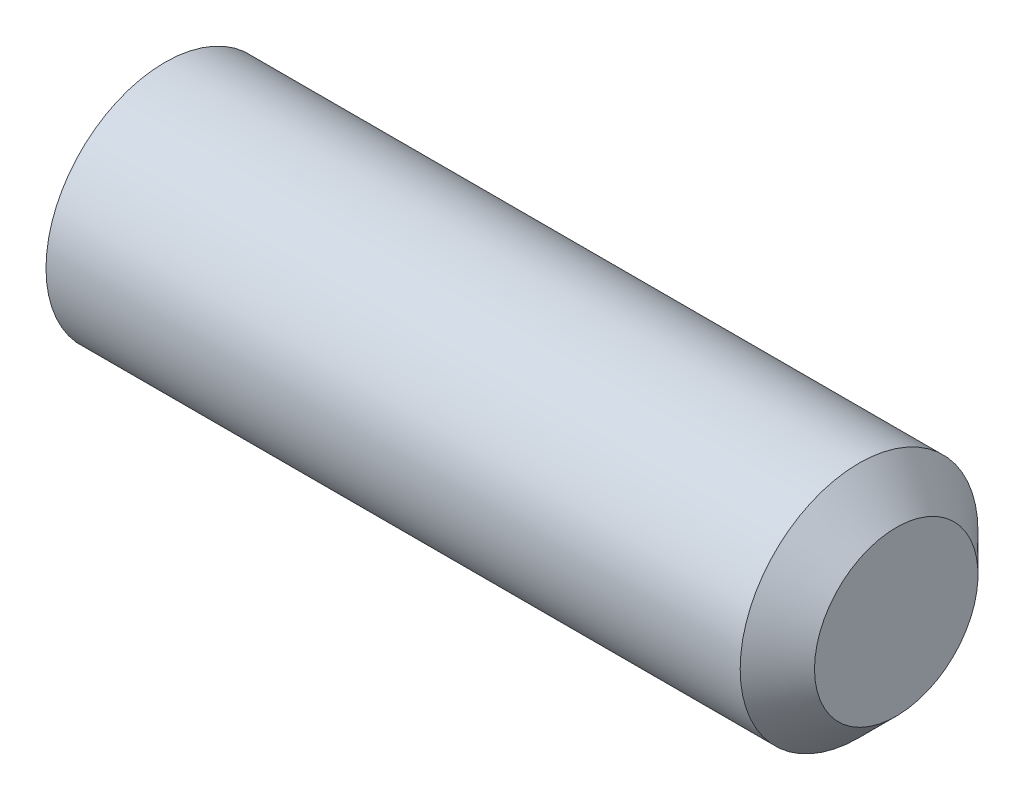
ISO-10303-21;
HEADER;
FILE_DESCRIPTION(('STEP AP214'),'2;1');
FILE_NAME('part.step','',(''),(''),'','','');
FILE_SCHEMA(('AUTOMOTIVE_DESIGN { 1 0 10303 214 1 1 1 1 }'));
ENDSEC;
DATA;
#1=APPLICATION_CONTEXT('core data for automotive mechanical design processes');
#2=APPLICATION_PROTOCOL_DEFINITION('international standard','automotive_design',2000,#1);
#3=PRODUCT_CONTEXT('',#1,'mechanical');
#4=PRODUCT('Part','Part','',(#3));
#5=PRODUCT_RELATED_PRODUCT_CATEGORY('part','',(#4));
#6=PRODUCT_DEFINITION_FORMATION('','',#4);
#7=PRODUCT_DEFINITION_CONTEXT('part definition',#1,'design');
#8=PRODUCT_DEFINITION('design','',#6,#7);
#9=PRODUCT_DEFINITION_SHAPE('','',#8);
#10=(LENGTH_UNIT() NAMED_UNIT(*) SI_UNIT(.MILLI.,.METRE.));
#11=(NAMED_UNIT(*) PLANE_ANGLE_UNIT() SI_UNIT($,.RADIAN.));
#12=(NAMED_UNIT(*) SI_UNIT($,.STERADIAN.) SOLID_ANGLE_UNIT());
#13=UNCERTAINTY_MEASURE_WITH_UNIT(LENGTH_MEASURE(1.E-05),#10,'distance_accuracy_value','');
#14=(GEOMETRIC_REPRESENTATION_CONTEXT(3) GLOBAL_UNCERTAINTY_ASSIGNED_CONTEXT((#13)) GLOBAL_UNIT_ASSIGNED_CONTEXT((#10,
#11,#12)) REPRESENTATION_CONTEXT('',''));
#15=CARTESIAN_POINT('',(0.,0.,0.));
#16=DIRECTION('',(0.,0.,1.));
#17=DIRECTION('',(1.,0.,0.));
#18=AXIS2_PLACEMENT_3D('',#15,#16,#17);
#19=CARTESIAN_POINT('',(0.,0.,0.));
#20=DIRECTION('',(-1.,0.,0.));
#21=DIRECTION('',(0.,0.,1.));
#22=AXIS2_PLACEMENT_3D('',#19,#20,#21);
#23=PLANE('',#22);
#24=CARTESIAN_POINT('',(0.,0.,0.));
#25=DIRECTION('',(-1.,0.,0.));
#26=DIRECTION('',(0.,0.,1.));
#27=AXIS2_PLACEMENT_3D('',#24,#25,#26);
#28=CIRCLE('',#27,3.3095);
#29=CARTESIAN_POINT('',(0.,0.,3.3095));
#30=VERTEX_POINT('',#29);
#31=EDGE_CURVE('E165',#30,#30,#28,.T.);
#32=ORIENTED_EDGE('',*,*,#31,.T.);
#33=EDGE_LOOP('',(#32));
#34=FACE_BOUND('',#33,.T.);
#35=DIRECTION('',(0.,0.,-1.));
#36=VECTOR('',#35,1.);
#37=CARTESIAN_POINT('',(0.,2.,1.15470053837925));
#38=LINE('',#37,#36);
#39=CARTESIAN_POINT('',(0.,2.,1.15470053837925));
#40=VERTEX_POINT('',#39);
#41=CARTESIAN_POINT('',(0.,2.,-1.15470053837925));
#42=VERTEX_POINT('',#41);
#43=EDGE_CURVE('E150',#40,#42,#38,.T.);
#44=ORIENTED_EDGE('',*,*,#43,.F.);
#45=DIRECTION('',(0.,-0.866025403784438,0.500000000000001));
#46=VECTOR('',#45,1.);
#47=CARTESIAN_POINT('',(0.,2.,1.15470053837925));
#48=LINE('',#47,#46);
#49=CARTESIAN_POINT('',(0.,0.,2.3094010767585));
#50=VERTEX_POINT('',#49);
#51=EDGE_CURVE('E63',#40,#50,#48,.T.);
#52=ORIENTED_EDGE('',*,*,#51,.T.);
#53=DIRECTION('',(0.,0.866025403784439,0.5));
#54=VECTOR('',#53,1.);
#55=CARTESIAN_POINT('',(0.,-2.,1.15470053837925));
#56=LINE('',#55,#54);
#57=CARTESIAN_POINT('',(0.,-2.,1.15470053837925));
#58=VERTEX_POINT('',#57);
#59=EDGE_CURVE('E137',#58,#50,#56,.T.);
#60=ORIENTED_EDGE('',*,*,#59,.F.);
#61=DIRECTION('',(0.,0.,-1.));
#62=VECTOR('',#61,1.);
#63=CARTESIAN_POINT('',(0.,-2.,1.15470053837925));
#64=LINE('',#63,#62);
#65=CARTESIAN_POINT('',(0.,-2.,-1.15470053837925));
#66=VERTEX_POINT('',#65);
#67=EDGE_CURVE('E141',#58,#66,#64,.T.);
#68=ORIENTED_EDGE('',*,*,#67,.T.);
#69=DIRECTION('',(0.,0.866025403784438,-0.500000000000001));
#70=VECTOR('',#69,1.);
#71=CARTESIAN_POINT('',(0.,-2.,-1.15470053837925));
#72=LINE('',#71,#70);
#73=CARTESIAN_POINT('',(0.,0.,-2.3094010767585));
#74=VERTEX_POINT('',#73);
#75=EDGE_CURVE('E145',#66,#74,#72,.T.);
#76=ORIENTED_EDGE('',*,*,#75,.T.);
#77=DIRECTION('',(0.,-0.866025403784438,-0.5));
#78=VECTOR('',#77,1.);
#79=CARTESIAN_POINT('',(0.,2.,-1.15470053837925));
#80=LINE('',#79,#78);
#81=EDGE_CURVE('E122',#42,#74,#80,.T.);
#82=ORIENTED_EDGE('',*,*,#81,.F.);
#83=EDGE_LOOP('',(#44,#52,#60,#68,#76,#82));
#84=FACE_BOUND('',#83,.T.);
#85=ADVANCED_FACE('F47',(#34,#84),#23,.T.);
#86=CARTESIAN_POINT('',(25.,2.75,0.));
#87=DIRECTION('',(1.,0.,0.));
#88=DIRECTION('',(0.,0.,-1.));
#89=AXIS2_PLACEMENT_3D('',#86,#87,#88);
#90=PLANE('',#89);
#91=CARTESIAN_POINT('',(25.,0.,0.));
#92=DIRECTION('',(-1.,0.,0.));
#93=DIRECTION('',(0.,0.,1.));
#94=AXIS2_PLACEMENT_3D('',#91,#92,#93);
#95=CIRCLE('',#94,2.75);
#96=CARTESIAN_POINT('',(25.,0.,2.75));
#97=VERTEX_POINT('',#96);
#98=EDGE_CURVE('E11',#97,#97,#95,.T.);
#99=ORIENTED_EDGE('',*,*,#98,.F.);
#100=EDGE_LOOP('',(#99));
#101=FACE_BOUND('',#100,.T.);
#102=ADVANCED_FACE('F49',(#101),#90,.T.);
#103=CARTESIAN_POINT('',(23.75,0.,0.));
#104=DIRECTION('',(-1.,0.,0.));
#105=DIRECTION('',(0.,0.,1.));
#106=AXIS2_PLACEMENT_3D('',#103,#104,#105);
#107=CONICAL_SURFACE('',#106,4.,0.785398163397453);
#108=ORIENTED_EDGE('',*,*,#98,.T.);
#109=EDGE_LOOP('',(#108));
#110=FACE_BOUND('',#109,.T.);
#111=CARTESIAN_POINT('',(23.75,0.,0.));
#112=DIRECTION('',(-1.,0.,0.));
#113=DIRECTION('',(0.,0.,1.));
#114=AXIS2_PLACEMENT_3D('',#111,#112,#113);
#115=CIRCLE('',#114,4.);
#116=CARTESIAN_POINT('',(23.75,0.,4.));
#117=VERTEX_POINT('',#116);
#118=EDGE_CURVE('E56',#117,#117,#115,.T.);
#119=ORIENTED_EDGE('',*,*,#118,.F.);
#120=EDGE_LOOP('',(#119));
#121=FACE_BOUND('',#120,.T.);
#122=ADVANCED_FACE('F179',(#110,#121),#107,.T.);
#123=CARTESIAN_POINT('',(-12.7,0.,0.));
#124=DIRECTION('',(-1.,0.,0.));
#125=DIRECTION('',(0.,0.,1.));
#126=AXIS2_PLACEMENT_3D('',#123,#124,#125);
#127=CYLINDRICAL_SURFACE('',#126,4.);
#128=ORIENTED_EDGE('',*,*,#118,.T.);
#129=EDGE_LOOP('',(#128));
#130=FACE_BOUND('',#129,.T.);
#131=CARTESIAN_POINT('',(0.398660360875436,0.,0.));
#132=DIRECTION('',(-1.,0.,0.));
#133=DIRECTION('',(0.,0.,1.));
#134=AXIS2_PLACEMENT_3D('',#131,#132,#133);
#135=CIRCLE('',#134,4.);
#136=CARTESIAN_POINT('',(0.398660360875436,0.,4.));
#137=VERTEX_POINT('',#136);
#138=EDGE_CURVE('E169',#137,#137,#135,.T.);
#139=ORIENTED_EDGE('',*,*,#138,.F.);
#140=EDGE_LOOP('',(#139));
#141=FACE_BOUND('',#140,.T.);
#142=ADVANCED_FACE('F176',(#130,#141),#127,.T.);
#143=CARTESIAN_POINT('',(0.,0.,0.));
#144=DIRECTION('',(1.,0.,0.));
#145=DIRECTION('',(0.,0.,-1.));
#146=AXIS2_PLACEMENT_3D('',#143,#144,#145);
#147=CONICAL_SURFACE('',#146,3.3095,1.0471975511966);
#148=ORIENTED_EDGE('',*,*,#138,.T.);
#149=EDGE_LOOP('',(#148));
#150=FACE_BOUND('',#149,.T.);
#151=ORIENTED_EDGE('',*,*,#31,.F.);
#152=EDGE_LOOP('',(#151));
#153=FACE_BOUND('',#152,.T.);
#154=ADVANCED_FACE('F185',(#150,#153),#147,.T.);
#155=CARTESIAN_POINT('',(4.,2.,1.15470053837925));
#156=DIRECTION('',(0.,-0.500000000000001,-0.866025403784438));
#157=DIRECTION('',(0.,0.866025403784438,-0.500000000000001));
#158=AXIS2_PLACEMENT_3D('',#155,#156,#157);
#159=PLANE('',#158);
#160=ORIENTED_EDGE('',*,*,#51,.F.);
#161=DIRECTION('',(-1.,0.,0.));
#162=VECTOR('',#161,1.);
#163=CARTESIAN_POINT('',(4.,2.,1.15470053837925));
#164=LINE('',#163,#162);
#165=CARTESIAN_POINT('',(4.,2.,1.15470053837925));
#166=VERTEX_POINT('',#165);
#167=EDGE_CURVE('E68',#166,#40,#164,.T.);
#168=ORIENTED_EDGE('',*,*,#167,.F.);
#169=DIRECTION('',(0.,-0.866025403784438,0.500000000000001));
#170=VECTOR('',#169,1.);
#171=CARTESIAN_POINT('',(4.,2.,1.15470053837925));
#172=LINE('',#171,#170);
#173=CARTESIAN_POINT('',(4.,0.,2.3094010767585));
#174=VERTEX_POINT('',#173);
#175=EDGE_CURVE('E95',#166,#174,#172,.T.);
#176=ORIENTED_EDGE('',*,*,#175,.T.);
#177=DIRECTION('',(-1.,0.,0.));
#178=VECTOR('',#177,1.);
#179=CARTESIAN_POINT('',(4.,0.,2.3094010767585));
#180=LINE('',#179,#178);
#181=EDGE_CURVE('E162',#174,#50,#180,.T.);
#182=ORIENTED_EDGE('',*,*,#181,.T.);
#183=EDGE_LOOP('',(#160,#168,#176,#182));
#184=FACE_BOUND('',#183,.T.);
#185=ADVANCED_FACE('F199',(#184),#159,.T.);
#186=CARTESIAN_POINT('',(4.,-2.,1.15470053837925));
#187=DIRECTION('',(0.,-0.5,0.866025403784439));
#188=DIRECTION('',(0.,-0.866025403784439,-0.5));
#189=AXIS2_PLACEMENT_3D('',#186,#187,#188);
#190=PLANE('',#189);
#191=ORIENTED_EDGE('',*,*,#59,.T.);
#192=ORIENTED_EDGE('',*,*,#181,.F.);
#193=DIRECTION('',(0.,0.866025403784439,0.5));
#194=VECTOR('',#193,1.);
#195=CARTESIAN_POINT('',(4.,-2.,1.15470053837925));
#196=LINE('',#195,#194);
#197=CARTESIAN_POINT('',(4.,-2.,1.15470053837925));
#198=VERTEX_POINT('',#197);
#199=EDGE_CURVE('E300',#198,#174,#196,.T.);
#200=ORIENTED_EDGE('',*,*,#199,.F.);
#201=DIRECTION('',(-1.,0.,0.));
#202=VECTOR('',#201,1.);
#203=CARTESIAN_POINT('',(4.,-2.,1.15470053837925));
#204=LINE('',#203,#202);
#205=EDGE_CURVE('E159',#198,#58,#204,.T.);
#206=ORIENTED_EDGE('',*,*,#205,.T.);
#207=EDGE_LOOP('',(#191,#192,#200,#206));
#208=FACE_BOUND('',#207,.T.);
#209=ADVANCED_FACE('F205',(#208),#190,.F.);
#210=CARTESIAN_POINT('',(4.,-2.,1.15470053837925));
#211=DIRECTION('',(0.,1.,0.));
#212=DIRECTION('',(0.,0.,1.));
#213=AXIS2_PLACEMENT_3D('',#210,#211,#212);
#214=PLANE('',#213);
#215=ORIENTED_EDGE('',*,*,#67,.F.);
#216=ORIENTED_EDGE('',*,*,#205,.F.);
#217=DIRECTION('',(0.,0.,-1.));
#218=VECTOR('',#217,1.);
#219=CARTESIAN_POINT('',(4.,-2.,1.15470053837925));
#220=LINE('',#219,#218);
#221=CARTESIAN_POINT('',(4.,-2.,-1.15470053837925));
#222=VERTEX_POINT('',#221);
#223=EDGE_CURVE('E117',#198,#222,#220,.T.);
#224=ORIENTED_EDGE('',*,*,#223,.T.);
#225=DIRECTION('',(-1.,0.,0.));
#226=VECTOR('',#225,1.);
#227=CARTESIAN_POINT('',(4.,-2.,-1.15470053837925));
#228=LINE('',#227,#226);
#229=EDGE_CURVE('E111',#222,#66,#228,.T.);
#230=ORIENTED_EDGE('',*,*,#229,.T.);
#231=EDGE_LOOP('',(#215,#216,#224,#230));
#232=FACE_BOUND('',#231,.T.);
#233=ADVANCED_FACE('F212',(#232),#214,.T.);
#234=CARTESIAN_POINT('',(4.,-2.,-1.15470053837925));
#235=DIRECTION('',(0.,0.500000000000001,0.866025403784438));
#236=DIRECTION('',(0.,-0.866025403784438,0.500000000000001));
#237=AXIS2_PLACEMENT_3D('',#234,#235,#236);
#238=PLANE('',#237);
#239=ORIENTED_EDGE('',*,*,#75,.F.);
#240=ORIENTED_EDGE('',*,*,#229,.F.);
#241=DIRECTION('',(0.,0.866025403784438,-0.500000000000001));
#242=VECTOR('',#241,1.);
#243=CARTESIAN_POINT('',(4.,-2.,-1.15470053837925));
#244=LINE('',#243,#242);
#245=CARTESIAN_POINT('',(4.,0.,-2.3094010767585));
#246=VERTEX_POINT('',#245);
#247=EDGE_CURVE('E106',#222,#246,#244,.T.);
#248=ORIENTED_EDGE('',*,*,#247,.T.);
#249=DIRECTION('',(-1.,0.,0.));
#250=VECTOR('',#249,1.);
#251=CARTESIAN_POINT('',(4.,0.,-2.3094010767585));
#252=LINE('',#251,#250);
#253=EDGE_CURVE('E110',#246,#74,#252,.T.);
#254=ORIENTED_EDGE('',*,*,#253,.T.);
#255=EDGE_LOOP('',(#239,#240,#248,#254));
#256=FACE_BOUND('',#255,.T.);
#257=ADVANCED_FACE('F109',(#256),#238,.T.);
#258=CARTESIAN_POINT('',(4.,2.,-1.15470053837925));
#259=DIRECTION('',(0.,0.5,-0.866025403784439));
#260=DIRECTION('',(0.,0.866025403784438,0.5));
#261=AXIS2_PLACEMENT_3D('',#258,#259,#260);
#262=PLANE('',#261);
#263=ORIENTED_EDGE('',*,*,#81,.T.);
#264=ORIENTED_EDGE('',*,*,#253,.F.);
#265=DIRECTION('',(0.,-0.866025403784438,-0.5));
#266=VECTOR('',#265,1.);
#267=CARTESIAN_POINT('',(4.,2.,-1.15470053837925));
#268=LINE('',#267,#266);
#269=CARTESIAN_POINT('',(4.,2.,-1.15470053837925));
#270=VERTEX_POINT('',#269);
#271=EDGE_CURVE('E116',#270,#246,#268,.T.);
#272=ORIENTED_EDGE('',*,*,#271,.F.);
#273=DIRECTION('',(-1.,0.,0.));
#274=VECTOR('',#273,1.);
#275=CARTESIAN_POINT('',(4.,2.,-1.15470053837925));
#276=LINE('',#275,#274);
#277=EDGE_CURVE('E91',#270,#42,#276,.T.);
#278=ORIENTED_EDGE('',*,*,#277,.T.);
#279=EDGE_LOOP('',(#263,#264,#272,#278));
#280=FACE_BOUND('',#279,.T.);
#281=ADVANCED_FACE('F119',(#280),#262,.F.);
#282=CARTESIAN_POINT('',(4.,2.,1.15470053837925));
#283=DIRECTION('',(0.,1.,0.));
#284=DIRECTION('',(0.,0.,1.));
#285=AXIS2_PLACEMENT_3D('',#282,#283,#284);
#286=PLANE('',#285);
#287=ORIENTED_EDGE('',*,*,#43,.T.);
#288=ORIENTED_EDGE('',*,*,#277,.F.);
#289=DIRECTION('',(0.,0.,-1.));
#290=VECTOR('',#289,1.);
#291=CARTESIAN_POINT('',(4.,2.,1.15470053837925));
#292=LINE('',#291,#290);
#293=EDGE_CURVE('E128',#166,#270,#292,.T.);
#294=ORIENTED_EDGE('',*,*,#293,.F.);
#295=ORIENTED_EDGE('',*,*,#167,.T.);
#296=EDGE_LOOP('',(#287,#288,#294,#295));
#297=FACE_BOUND('',#296,.T.);
#298=ADVANCED_FACE('F224',(#297),#286,.F.);
#299=CARTESIAN_POINT('',(4.,4.,0.));
#300=DIRECTION('',(1.,0.,0.));
#301=DIRECTION('',(0.,0.,-1.));
#302=AXIS2_PLACEMENT_3D('',#299,#300,#301);
#303=PLANE('',#302);
#304=ORIENTED_EDGE('',*,*,#175,.F.);
#305=ORIENTED_EDGE('',*,*,#293,.T.);
#306=ORIENTED_EDGE('',*,*,#271,.T.);
#307=ORIENTED_EDGE('',*,*,#247,.F.);
#308=ORIENTED_EDGE('',*,*,#223,.F.);
#309=ORIENTED_EDGE('',*,*,#199,.T.);
#310=EDGE_LOOP('',(#304,#305,#306,#307,#308,#309));
#311=FACE_BOUND('',#310,.T.);
#312=ADVANCED_FACE('F126',(#311),#303,.F.);
#313=CLOSED_SHELL('',(#85,#102,#122,#142,#154,#185,#209,#233,#257,#281,#298,#312));
#314=MANIFOLD_SOLID_BREP('B2',#313);
#315=ADVANCED_BREP_SHAPE_REPRESENTATION('',(#18,#314),#14);
#316=SHAPE_DEFINITION_REPRESENTATION(#9,#315);
ENDSEC;
END-ISO-10303-21;
